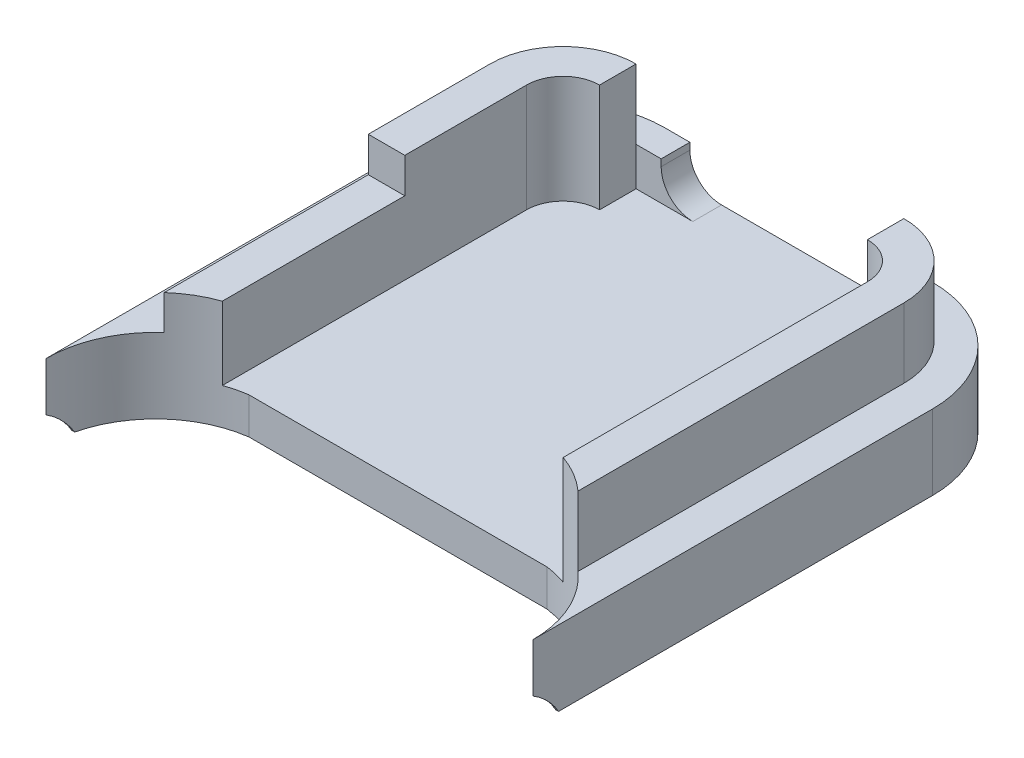
ISO-10303-21;
HEADER;
FILE_DESCRIPTION(('STEP AP214'),'2;1');
FILE_NAME('part.step','',(''),(''),'','','');
FILE_SCHEMA(('AUTOMOTIVE_DESIGN { 1 0 10303 214 1 1 1 1 }'));
ENDSEC;
DATA;
#1=APPLICATION_CONTEXT('core data for automotive mechanical design processes');
#2=APPLICATION_PROTOCOL_DEFINITION('international standard','automotive_design',2000,#1);
#3=PRODUCT_CONTEXT('',#1,'mechanical');
#4=PRODUCT('Part','Part','',(#3));
#5=PRODUCT_RELATED_PRODUCT_CATEGORY('part','',(#4));
#6=PRODUCT_DEFINITION_FORMATION('','',#4);
#7=PRODUCT_DEFINITION_CONTEXT('part definition',#1,'design');
#8=PRODUCT_DEFINITION('design','',#6,#7);
#9=PRODUCT_DEFINITION_SHAPE('','',#8);
#10=(LENGTH_UNIT() NAMED_UNIT(*) SI_UNIT(.MILLI.,.METRE.));
#11=(NAMED_UNIT(*) PLANE_ANGLE_UNIT() SI_UNIT($,.RADIAN.));
#12=(NAMED_UNIT(*) SI_UNIT($,.STERADIAN.) SOLID_ANGLE_UNIT());
#13=UNCERTAINTY_MEASURE_WITH_UNIT(LENGTH_MEASURE(1.E-05),#10,'distance_accuracy_value','');
#14=(GEOMETRIC_REPRESENTATION_CONTEXT(3) GLOBAL_UNCERTAINTY_ASSIGNED_CONTEXT((#13)) GLOBAL_UNIT_ASSIGNED_CONTEXT((#10,
#11,#12)) REPRESENTATION_CONTEXT('',''));
#15=CARTESIAN_POINT('',(0.,0.,0.));
#16=DIRECTION('',(0.,0.,1.));
#17=DIRECTION('',(1.,0.,0.));
#18=AXIS2_PLACEMENT_3D('',#15,#16,#17);
#19=CARTESIAN_POINT('',(18.5,0.73,-3.));
#20=DIRECTION('',(1.,0.,0.));
#21=DIRECTION('',(0.,0.,-1.));
#22=AXIS2_PLACEMENT_3D('',#19,#20,#21);
#23=PLANE('',#22);
#24=CARTESIAN_POINT('',(18.5,-1.35,-2.72000000000003));
#25=DIRECTION('',(1.,0.,0.));
#26=DIRECTION('',(0.,0.,1.));
#27=AXIS2_PLACEMENT_3D('',#24,#25,#26);
#28=CIRCLE('',#27,3.);
#29=CARTESIAN_POINT('',(18.5,0.15,-5.31807621135335));
#30=VERTEX_POINT('',#29);
#31=CARTESIAN_POINT('',(18.5,1.22276967158298,-4.26300233861874));
#32=VERTEX_POINT('',#31);
#33=EDGE_CURVE('E188',#30,#32,#28,.T.);
#34=ORIENTED_EDGE('',*,*,#33,.F.);
#35=DIRECTION('',(0.,0.,-1.));
#36=VECTOR('',#35,1.);
#37=CARTESIAN_POINT('',(18.5,0.15,-1.64440913302023));
#38=LINE('',#37,#36);
#39=CARTESIAN_POINT('',(18.5,0.15,-20.68));
#40=VERTEX_POINT('',#39);
#41=EDGE_CURVE('E385',#30,#40,#38,.T.);
#42=ORIENTED_EDGE('',*,*,#41,.T.);
#43=DIRECTION('',(0.,1.,0.));
#44=VECTOR('',#43,1.);
#45=CARTESIAN_POINT('',(18.5,0.73,-20.68));
#46=LINE('',#45,#44);
#47=CARTESIAN_POINT('',(18.5,3.23,-20.68));
#48=VERTEX_POINT('',#47);
#49=EDGE_CURVE('E482',#40,#48,#46,.T.);
#50=ORIENTED_EDGE('',*,*,#49,.T.);
#51=DIRECTION('',(0.,0.,-1.));
#52=VECTOR('',#51,1.);
#53=CARTESIAN_POINT('',(18.5,3.23,-3.));
#54=LINE('',#53,#52);
#55=CARTESIAN_POINT('',(18.5,3.23,-4.26300233861874));
#56=VERTEX_POINT('',#55);
#57=EDGE_CURVE('E462',#56,#48,#54,.T.);
#58=ORIENTED_EDGE('',*,*,#57,.F.);
#59=DIRECTION('',(0.,-1.,0.));
#60=VECTOR('',#59,1.);
#61=CARTESIAN_POINT('',(18.5,6.09,-4.26300233861874));
#62=LINE('',#61,#60);
#63=EDGE_CURVE('E380',#56,#32,#62,.T.);
#64=ORIENTED_EDGE('',*,*,#63,.T.);
#65=EDGE_LOOP('',(#34,#42,#50,#58,#64));
#66=FACE_BOUND('',#65,.T.);
#67=ADVANCED_FACE('F167',(#66),#23,.T.);
#68=CARTESIAN_POINT('',(11.67,1.65,-23.68));
#69=DIRECTION('',(0.,-1.,0.));
#70=DIRECTION('',(1.,0.,0.));
#71=AXIS2_PLACEMENT_3D('',#68,#69,#70);
#72=PLANE('',#71);
#73=DIRECTION('',(1.,0.,0.));
#74=VECTOR('',#73,1.);
#75=CARTESIAN_POINT('',(11.67,1.65,-8.72000000000004));
#76=LINE('',#75,#74);
#77=CARTESIAN_POINT('',(2.3793778553406,1.65,-8.72000000000004));
#78=VERTEX_POINT('',#77);
#79=CARTESIAN_POINT('',(14.6206221446594,1.65,-8.72000000000004));
#80=VERTEX_POINT('',#79);
#81=EDGE_CURVE('E561',#78,#80,#76,.T.);
#82=ORIENTED_EDGE('',*,*,#81,.T.);
#83=CARTESIAN_POINT('',(14.,1.65,-4.26300233861874));
#84=DIRECTION('',(0.,-1.,0.));
#85=DIRECTION('',(1.,0.,0.));
#86=AXIS2_PLACEMENT_3D('',#83,#84,#85);
#87=CIRCLE('',#86,4.5);
#88=CARTESIAN_POINT('',(15.5,1.65,-8.50564302573803));
#89=VERTEX_POINT('',#88);
#90=EDGE_CURVE('E511',#80,#89,#87,.T.);
#91=ORIENTED_EDGE('',*,*,#90,.T.);
#92=DIRECTION('',(0.,0.,1.));
#93=VECTOR('',#92,1.);
#94=CARTESIAN_POINT('',(15.5,1.65,-7.00000000000002));
#95=LINE('',#94,#93);
#96=CARTESIAN_POINT('',(15.5,1.65,-21.));
#97=VERTEX_POINT('',#96);
#98=EDGE_CURVE('E591',#97,#89,#95,.T.);
#99=ORIENTED_EDGE('',*,*,#98,.F.);
#100=CARTESIAN_POINT('',(14.,1.65,-21.));
#101=DIRECTION('',(0.,-1.,0.));
#102=DIRECTION('',(-1.,0.,0.));
#103=AXIS2_PLACEMENT_3D('',#100,#101,#102);
#104=CIRCLE('',#103,1.5);
#105=CARTESIAN_POINT('',(14.,1.65,-22.5));
#106=VERTEX_POINT('',#105);
#107=EDGE_CURVE('E595',#106,#97,#104,.T.);
#108=ORIENTED_EDGE('',*,*,#107,.F.);
#109=DIRECTION('',(0.,0.,1.));
#110=VECTOR('',#109,1.);
#111=CARTESIAN_POINT('',(14.,1.65,-24.));
#112=LINE('',#111,#110);
#113=CARTESIAN_POINT('',(14.,1.65,-24.));
#114=VERTEX_POINT('',#113);
#115=EDGE_CURVE('E599',#114,#106,#112,.T.);
#116=ORIENTED_EDGE('',*,*,#115,.F.);
#117=DIRECTION('',(1.,0.,0.));
#118=VECTOR('',#117,1.);
#119=CARTESIAN_POINT('',(3.,1.65,-24.));
#120=LINE('',#119,#118);
#121=CARTESIAN_POINT('',(11.67,1.65,-24.));
#122=VERTEX_POINT('',#121);
#123=EDGE_CURVE('E403',#122,#114,#120,.T.);
#124=ORIENTED_EDGE('',*,*,#123,.F.);
#125=DIRECTION('',(0.,0.,-1.));
#126=VECTOR('',#125,1.);
#127=CARTESIAN_POINT('',(11.67,1.65,-23.68));
#128=LINE('',#127,#126);
#129=CARTESIAN_POINT('',(11.67,1.65,-25.18));
#130=VERTEX_POINT('',#129);
#131=EDGE_CURVE('E419',#122,#130,#128,.T.);
#132=ORIENTED_EDGE('',*,*,#131,.T.);
#133=DIRECTION('',(1.,0.,0.));
#134=VECTOR('',#133,1.);
#135=CARTESIAN_POINT('',(11.67,1.65,-25.18));
#136=LINE('',#135,#134);
#137=CARTESIAN_POINT('',(5.33000000000001,1.65,-25.18));
#138=VERTEX_POINT('',#137);
#139=EDGE_CURVE('E717',#130,#138,#136,.F.);
#140=ORIENTED_EDGE('',*,*,#139,.T.);
#141=DIRECTION('',(0.,0.,-1.));
#142=VECTOR('',#141,1.);
#143=CARTESIAN_POINT('',(5.33000000000001,1.65,-23.68));
#144=LINE('',#143,#142);
#145=CARTESIAN_POINT('',(5.33000000000001,1.65,-24.));
#146=VERTEX_POINT('',#145);
#147=EDGE_CURVE('E423',#146,#138,#144,.T.);
#148=ORIENTED_EDGE('',*,*,#147,.F.);
#149=CARTESIAN_POINT('',(3.00000000000003,1.65,-24.));
#150=VERTEX_POINT('',#149);
#151=EDGE_CURVE('E415',#150,#146,#120,.T.);
#152=ORIENTED_EDGE('',*,*,#151,.F.);
#153=DIRECTION('',(0.,0.,-1.));
#154=VECTOR('',#153,1.);
#155=CARTESIAN_POINT('',(3.00000000000003,1.65,-24.));
#156=LINE('',#155,#154);
#157=CARTESIAN_POINT('',(3.00000000000002,1.65,-22.5));
#158=VERTEX_POINT('',#157);
#159=EDGE_CURVE('E623',#158,#150,#156,.T.);
#160=ORIENTED_EDGE('',*,*,#159,.F.);
#161=CARTESIAN_POINT('',(3.00000000000001,1.65,-21.));
#162=DIRECTION('',(0.,-1.,0.));
#163=DIRECTION('',(-1.,0.,0.));
#164=AXIS2_PLACEMENT_3D('',#161,#162,#163);
#165=CIRCLE('',#164,1.5);
#166=CARTESIAN_POINT('',(1.50000000000001,1.65,-21.));
#167=VERTEX_POINT('',#166);
#168=EDGE_CURVE('E641',#167,#158,#165,.T.);
#169=ORIENTED_EDGE('',*,*,#168,.F.);
#170=DIRECTION('',(0.,0.,-1.));
#171=VECTOR('',#170,1.);
#172=CARTESIAN_POINT('',(1.50000000000001,1.65,-21.));
#173=LINE('',#172,#171);
#174=CARTESIAN_POINT('',(1.50000000000001,1.65,-8.50564302573803));
#175=VERTEX_POINT('',#174);
#176=EDGE_CURVE('E602',#175,#167,#173,.T.);
#177=ORIENTED_EDGE('',*,*,#176,.F.);
#178=CARTESIAN_POINT('',(2.99999999999999,1.65,-4.26300233861874));
#179=DIRECTION('',(0.,-1.,0.));
#180=DIRECTION('',(1.,0.,0.));
#181=AXIS2_PLACEMENT_3D('',#178,#179,#180);
#182=CIRCLE('',#181,4.5);
#183=EDGE_CURVE('E540',#175,#78,#182,.T.);
#184=ORIENTED_EDGE('',*,*,#183,.T.);
#185=EDGE_LOOP('',(#82,#91,#99,#108,#116,#124,#132,#140,#148,#152,#160,#169,#177,#184));
#186=FACE_BOUND('',#185,.T.);
#187=ADVANCED_FACE('F741',(#186),#72,.F.);
#188=CARTESIAN_POINT('',(1.50000000000001,6.09,-16.));
#189=DIRECTION('',(0.,0.,-1.));
#190=DIRECTION('',(-1.,0.,0.));
#191=AXIS2_PLACEMENT_3D('',#188,#189,#190);
#192=PLANE('',#191);
#193=DIRECTION('',(-1.,0.,0.));
#194=VECTOR('',#193,1.);
#195=CARTESIAN_POINT('',(0.,4.65,-16.));
#196=LINE('',#195,#194);
#197=CARTESIAN_POINT('',(1.50000000000001,4.65,-16.));
#198=VERTEX_POINT('',#197);
#199=CARTESIAN_POINT('',(0.,4.65,-16.));
#200=VERTEX_POINT('',#199);
#201=EDGE_CURVE('E564',#198,#200,#196,.T.);
#202=ORIENTED_EDGE('',*,*,#201,.F.);
#203=DIRECTION('',(0.,-1.,0.));
#204=VECTOR('',#203,1.);
#205=CARTESIAN_POINT('',(1.50000000000001,6.09,-16.));
#206=LINE('',#205,#204);
#207=CARTESIAN_POINT('',(1.50000000000001,6.09,-16.));
#208=VERTEX_POINT('',#207);
#209=EDGE_CURVE('E659',#208,#198,#206,.T.);
#210=ORIENTED_EDGE('',*,*,#209,.F.);
#211=DIRECTION('',(1.,0.,0.));
#212=VECTOR('',#211,1.);
#213=CARTESIAN_POINT('',(1.50000000000001,6.09,-16.));
#214=LINE('',#213,#212);
#215=CARTESIAN_POINT('',(0.,6.09,-16.));
#216=VERTEX_POINT('',#215);
#217=EDGE_CURVE('E626',#216,#208,#214,.T.);
#218=ORIENTED_EDGE('',*,*,#217,.F.);
#219=DIRECTION('',(0.,-1.,0.));
#220=VECTOR('',#219,1.);
#221=CARTESIAN_POINT('',(0.,6.09,-16.));
#222=LINE('',#221,#220);
#223=EDGE_CURVE('E663',#216,#200,#222,.T.);
#224=ORIENTED_EDGE('',*,*,#223,.T.);
#225=EDGE_LOOP('',(#202,#210,#218,#224));
#226=FACE_BOUND('',#225,.T.);
#227=ADVANCED_FACE('F801',(#226),#192,.F.);
#228=CARTESIAN_POINT('',(2.99999999999998,0.73,-25.18));
#229=DIRECTION('',(0.,0.,-1.));
#230=DIRECTION('',(-1.,0.,0.));
#231=AXIS2_PLACEMENT_3D('',#228,#229,#230);
#232=PLANE('',#231);
#233=DIRECTION('',(-1.,0.,0.));
#234=VECTOR('',#233,1.);
#235=CARTESIAN_POINT('',(18.5,0.15,-25.18));
#236=LINE('',#235,#234);
#237=CARTESIAN_POINT('',(14.,0.149999999999998,-25.18));
#238=VERTEX_POINT('',#237);
#239=CARTESIAN_POINT('',(3.00000000000003,0.149999999999999,-25.18));
#240=VERTEX_POINT('',#239);
#241=EDGE_CURVE('E397',#238,#240,#236,.T.);
#242=ORIENTED_EDGE('',*,*,#241,.T.);
#243=DIRECTION('',(0.,1.,0.));
#244=VECTOR('',#243,1.);
#245=CARTESIAN_POINT('',(2.99999999999998,0.73,-25.18));
#246=LINE('',#245,#244);
#247=CARTESIAN_POINT('',(2.99999999999999,3.2300025,-25.18));
#248=VERTEX_POINT('',#247);
#249=EDGE_CURVE('E481',#240,#248,#246,.T.);
#250=ORIENTED_EDGE('',*,*,#249,.T.);
#251=DIRECTION('',(-1.,0.,0.));
#252=VECTOR('',#251,1.);
#253=CARTESIAN_POINT('',(2.99999999999998,3.23,-25.18));
#254=LINE('',#253,#252);
#255=CARTESIAN_POINT('',(4.03000000000001,3.23,-25.18));
#256=VERTEX_POINT('',#255);
#257=EDGE_CURVE('E469',#256,#248,#254,.T.);
#258=ORIENTED_EDGE('',*,*,#257,.F.);
#259=DIRECTION('',(0.,1.,0.));
#260=VECTOR('',#259,1.);
#261=CARTESIAN_POINT('',(4.03000000000001,3.23,-25.18));
#262=LINE('',#261,#260);
#263=CARTESIAN_POINT('',(4.03000000000001,2.95,-25.18));
#264=VERTEX_POINT('',#263);
#265=EDGE_CURVE('E434',#264,#256,#262,.T.);
#266=ORIENTED_EDGE('',*,*,#265,.F.);
#267=CARTESIAN_POINT('',(5.33000000000001,2.95,-25.18));
#268=DIRECTION('',(0.,0.,-1.));
#269=DIRECTION('',(-1.,0.,0.));
#270=AXIS2_PLACEMENT_3D('',#267,#268,#269);
#271=CIRCLE('',#270,1.3);
#272=EDGE_CURVE('E491',#138,#264,#271,.T.);
#273=ORIENTED_EDGE('',*,*,#272,.F.);
#274=ORIENTED_EDGE('',*,*,#139,.F.);
#275=CARTESIAN_POINT('',(11.67,2.95,-25.18));
#276=DIRECTION('',(0.,0.,-1.));
#277=DIRECTION('',(-1.,0.,0.));
#278=AXIS2_PLACEMENT_3D('',#275,#276,#277);
#279=CIRCLE('',#278,1.3);
#280=CARTESIAN_POINT('',(12.97,2.94999999999999,-25.18));
#281=VERTEX_POINT('',#280);
#282=EDGE_CURVE('E709',#281,#130,#279,.T.);
#283=ORIENTED_EDGE('',*,*,#282,.F.);
#284=DIRECTION('',(0.,-1.,0.));
#285=VECTOR('',#284,1.);
#286=CARTESIAN_POINT('',(12.97,3.23,-25.18));
#287=LINE('',#286,#285);
#288=CARTESIAN_POINT('',(12.97,3.23,-25.18));
#289=VERTEX_POINT('',#288);
#290=EDGE_CURVE('E439',#289,#281,#287,.T.);
#291=ORIENTED_EDGE('',*,*,#290,.F.);
#292=CARTESIAN_POINT('',(14.,3.23,-25.18));
#293=VERTEX_POINT('',#292);
#294=EDGE_CURVE('E463',#293,#289,#254,.T.);
#295=ORIENTED_EDGE('',*,*,#294,.F.);
#296=DIRECTION('',(0.,1.,0.));
#297=VECTOR('',#296,1.);
#298=CARTESIAN_POINT('',(13.9999999999999,0.73,-25.18));
#299=LINE('',#298,#297);
#300=EDGE_CURVE('E478',#238,#293,#299,.T.);
#301=ORIENTED_EDGE('',*,*,#300,.F.);
#302=EDGE_LOOP('',(#242,#250,#258,#266,#273,#274,#283,#291,#295,#301));
#303=FACE_BOUND('',#302,.T.);
#304=ADVANCED_FACE('F734',(#303),#232,.T.);
#305=CARTESIAN_POINT('',(14.,3.23,-21.));
#306=DIRECTION('',(0.,1.,0.));
#307=DIRECTION('',(0.,0.,1.));
#308=AXIS2_PLACEMENT_3D('',#305,#306,#307);
#309=PLANE('',#308);
#310=CARTESIAN_POINT('',(2.99999999999999,3.23,-4.26300233861874));
#311=DIRECTION('',(0.,1.,0.));
#312=DIRECTION('',(0.,0.,1.));
#313=AXIS2_PLACEMENT_3D('',#310,#311,#312);
#314=CIRCLE('',#313,4.5);
#315=CARTESIAN_POINT('',(0.,3.23,-7.61710430486844));
#316=VERTEX_POINT('',#315);
#317=CARTESIAN_POINT('',(-1.50000000000001,3.23,-4.26300233861874));
#318=VERTEX_POINT('',#317);
#319=EDGE_CURVE('E537',#316,#318,#314,.T.);
#320=ORIENTED_EDGE('',*,*,#319,.F.);
#321=DIRECTION('',(0.,0.,-1.));
#322=VECTOR('',#321,1.);
#323=CARTESIAN_POINT('',(0.,3.23,-3.));
#324=LINE('',#323,#322);
#325=CARTESIAN_POINT('',(0.,3.23,-21.));
#326=VERTEX_POINT('',#325);
#327=EDGE_CURVE('E468',#316,#326,#324,.T.);
#328=ORIENTED_EDGE('',*,*,#327,.T.);
#329=CARTESIAN_POINT('',(3.,3.23,-21.));
#330=DIRECTION('',(0.,-1.,0.));
#331=DIRECTION('',(0.,0.,-1.));
#332=AXIS2_PLACEMENT_3D('',#329,#330,#331);
#333=CIRCLE('',#332,3.);
#334=CARTESIAN_POINT('',(3.,3.23,-24.));
#335=VERTEX_POINT('',#334);
#336=EDGE_CURVE('E703',#326,#335,#333,.T.);
#337=ORIENTED_EDGE('',*,*,#336,.T.);
#338=DIRECTION('',(1.,0.,0.));
#339=VECTOR('',#338,1.);
#340=CARTESIAN_POINT('',(3.,3.23,-24.));
#341=LINE('',#340,#339);
#342=CARTESIAN_POINT('',(4.03000000000001,3.23,-24.));
#343=VERTEX_POINT('',#342);
#344=EDGE_CURVE('E692',#335,#343,#341,.T.);
#345=ORIENTED_EDGE('',*,*,#344,.T.);
#346=DIRECTION('',(0.,0.,1.));
#347=VECTOR('',#346,1.);
#348=CARTESIAN_POINT('',(4.03000000000001,3.23,-25.1800144176629));
#349=LINE('',#348,#347);
#350=EDGE_CURVE('E431',#256,#343,#349,.T.);
#351=ORIENTED_EDGE('',*,*,#350,.F.);
#352=ORIENTED_EDGE('',*,*,#257,.T.);
#353=CARTESIAN_POINT('',(3.,3.23,-20.6800144176629));
#354=DIRECTION('',(0.,1.,0.));
#355=DIRECTION('',(0.,0.,1.));
#356=AXIS2_PLACEMENT_3D('',#353,#354,#355);
#357=CIRCLE('',#356,4.49998558233711);
#358=CARTESIAN_POINT('',(-1.49997116472041,3.2300025,-20.6914055513507));
#359=VERTEX_POINT('',#358);
#360=EDGE_CURVE('E398',#248,#359,#357,.T.);
#361=ORIENTED_EDGE('',*,*,#360,.T.);
#362=DIRECTION('',(-1.62990326197918E-06,0.,0.999999999998672));
#363=VECTOR('',#362,1.);
#364=CARTESIAN_POINT('',(-1.49997066170013,3.23,-21.0000252634528));
#365=LINE('',#364,#363);
#366=EDGE_CURVE('E406',#359,#318,#365,.T.);
#367=ORIENTED_EDGE('',*,*,#366,.T.);
#368=EDGE_LOOP('',(#320,#328,#337,#345,#351,#352,#361,#367));
#369=FACE_BOUND('',#368,.T.);
#370=ADVANCED_FACE('F763',(#369),#309,.T.);
#371=CARTESIAN_POINT('',(18.5,0.15,-25.18));
#372=DIRECTION('',(0.,1.,0.));
#373=DIRECTION('',(0.,0.,1.));
#374=AXIS2_PLACEMENT_3D('',#371,#372,#373);
#375=PLANE('',#374);
#376=ORIENTED_EDGE('',*,*,#41,.F.);
#377=DIRECTION('',(1.,0.,0.));
#378=VECTOR('',#377,1.);
#379=CARTESIAN_POINT('',(-1.50010866472042,0.15,-5.31807621135335));
#380=LINE('',#379,#378);
#381=CARTESIAN_POINT('',(18.3745650210133,0.15,-5.31807621135335));
#382=VERTEX_POINT('',#381);
#383=EDGE_CURVE('E373',#30,#382,#380,.F.);
#384=ORIENTED_EDGE('',*,*,#383,.T.);
#385=CARTESIAN_POINT('',(14.,0.15,-4.26300233861874));
#386=DIRECTION('',(0.,1.,0.));
#387=DIRECTION('',(0.,0.,1.));
#388=AXIS2_PLACEMENT_3D('',#385,#386,#387);
#389=CIRCLE('',#388,4.5);
#390=CARTESIAN_POINT('',(14.6206221446594,0.15,-8.72000000000004));
#391=VERTEX_POINT('',#390);
#392=EDGE_CURVE('E498',#382,#391,#389,.T.);
#393=ORIENTED_EDGE('',*,*,#392,.T.);
#394=DIRECTION('',(-1.,0.,0.));
#395=VECTOR('',#394,1.);
#396=CARTESIAN_POINT('',(18.5,0.15,-8.72000000000004));
#397=LINE('',#396,#395);
#398=CARTESIAN_POINT('',(2.3793778553406,0.15,-8.72000000000004));
#399=VERTEX_POINT('',#398);
#400=EDGE_CURVE('E181',#391,#399,#397,.T.);
#401=ORIENTED_EDGE('',*,*,#400,.T.);
#402=CARTESIAN_POINT('',(2.99999999999999,0.15,-4.26300233861874));
#403=DIRECTION('',(0.,1.,0.));
#404=DIRECTION('',(0.,0.,1.));
#405=AXIS2_PLACEMENT_3D('',#402,#403,#404);
#406=CIRCLE('',#405,4.5);
#407=CARTESIAN_POINT('',(-1.37456502101327,0.15,-5.31807621135335));
#408=VERTEX_POINT('',#407);
#409=EDGE_CURVE('E497',#399,#408,#406,.T.);
#410=ORIENTED_EDGE('',*,*,#409,.T.);
#411=CARTESIAN_POINT('',(-1.49999622176005,0.149999999999999,-5.3180762113499));
#412=VERTEX_POINT('',#411);
#413=EDGE_CURVE('E196',#408,#412,#380,.F.);
#414=ORIENTED_EDGE('',*,*,#413,.T.);
#415=DIRECTION('',(-1.62990326197918E-06,0.,0.999999999998672));
#416=VECTOR('',#415,1.);
#417=CARTESIAN_POINT('',(-1.50000488970583,0.15,-2.4448628627195E-06));
#418=LINE('',#417,#416);
#419=CARTESIAN_POINT('',(-1.49997116472041,0.15,-20.6914055513507));
#420=VERTEX_POINT('',#419);
#421=EDGE_CURVE('E677',#420,#412,#418,.T.);
#422=ORIENTED_EDGE('',*,*,#421,.F.);
#423=CARTESIAN_POINT('',(3.,0.149999999999999,-20.6800144176629));
#424=DIRECTION('',(0.,1.,0.));
#425=DIRECTION('',(-1.,0.,0.));
#426=AXIS2_PLACEMENT_3D('',#423,#424,#425);
#427=CIRCLE('',#426,4.49998558233711);
#428=EDGE_CURVE('E671',#240,#420,#427,.T.);
#429=ORIENTED_EDGE('',*,*,#428,.F.);
#430=ORIENTED_EDGE('',*,*,#241,.F.);
#431=CARTESIAN_POINT('',(14.,0.149999999999998,-20.68));
#432=DIRECTION('',(0.,1.,0.));
#433=DIRECTION('',(-1.,0.,0.));
#434=AXIS2_PLACEMENT_3D('',#431,#432,#433);
#435=CIRCLE('',#434,4.49999999999999);
#436=EDGE_CURVE('E395',#40,#238,#435,.T.);
#437=ORIENTED_EDGE('',*,*,#436,.F.);
#438=EDGE_LOOP('',(#376,#384,#393,#401,#410,#414,#422,#429,#430,#437));
#439=FACE_BOUND('',#438,.T.);
#440=ADVANCED_FACE('F392',(#439),#375,.F.);
#441=CARTESIAN_POINT('',(3.,0.73,-24.));
#442=DIRECTION('',(0.,0.,1.));
#443=DIRECTION('',(1.,0.,0.));
#444=AXIS2_PLACEMENT_3D('',#441,#442,#443);
#445=PLANE('',#444);
#446=DIRECTION('',(0.,1.,0.));
#447=VECTOR('',#446,1.);
#448=CARTESIAN_POINT('',(3.,0.73,-24.));
#449=LINE('',#448,#447);
#450=EDGE_CURVE('E710',#150,#335,#449,.T.);
#451=ORIENTED_EDGE('',*,*,#450,.F.);
#452=ORIENTED_EDGE('',*,*,#151,.T.);
#453=CARTESIAN_POINT('',(5.33000000000001,2.95,-24.));
#454=DIRECTION('',(0.,0.,1.));
#455=DIRECTION('',(1.,0.,0.));
#456=AXIS2_PLACEMENT_3D('',#453,#454,#455);
#457=CIRCLE('',#456,1.3);
#458=CARTESIAN_POINT('',(4.03000000000001,2.95,-24.));
#459=VERTEX_POINT('',#458);
#460=EDGE_CURVE('E450',#459,#146,#457,.T.);
#461=ORIENTED_EDGE('',*,*,#460,.F.);
#462=DIRECTION('',(0.,1.,0.));
#463=VECTOR('',#462,1.);
#464=CARTESIAN_POINT('',(4.03000000000001,0.73,-24.));
#465=LINE('',#464,#463);
#466=EDGE_CURVE('E435',#459,#343,#465,.T.);
#467=ORIENTED_EDGE('',*,*,#466,.T.);
#468=ORIENTED_EDGE('',*,*,#344,.F.);
#469=EDGE_LOOP('',(#451,#452,#461,#467,#468));
#470=FACE_BOUND('',#469,.T.);
#471=ADVANCED_FACE('F769',(#470),#445,.T.);
#472=CARTESIAN_POINT('',(11.67,2.95,-24.));
#473=DIRECTION('',(0.,0.,1.));
#474=DIRECTION('',(1.,0.,0.));
#475=AXIS2_PLACEMENT_3D('',#472,#473,#474);
#476=CIRCLE('',#475,1.3);
#477=CARTESIAN_POINT('',(12.97,2.95,-24.));
#478=VERTEX_POINT('',#477);
#479=EDGE_CURVE('E447',#122,#478,#476,.T.);
#480=ORIENTED_EDGE('',*,*,#479,.F.);
#481=ORIENTED_EDGE('',*,*,#123,.T.);
#482=DIRECTION('',(0.,1.,0.));
#483=VECTOR('',#482,1.);
#484=CARTESIAN_POINT('',(14.,0.73,-24.));
#485=LINE('',#484,#483);
#486=CARTESIAN_POINT('',(14.,3.23,-24.));
#487=VERTEX_POINT('',#486);
#488=EDGE_CURVE('E705',#114,#487,#485,.T.);
#489=ORIENTED_EDGE('',*,*,#488,.T.);
#490=CARTESIAN_POINT('',(12.97,3.23,-24.));
#491=VERTEX_POINT('',#490);
#492=EDGE_CURVE('E696',#491,#487,#341,.T.);
#493=ORIENTED_EDGE('',*,*,#492,.F.);
#494=DIRECTION('',(0.,-1.,0.));
#495=VECTOR('',#494,1.);
#496=CARTESIAN_POINT('',(12.97,0.729999999999876,-24.));
#497=LINE('',#496,#495);
#498=EDGE_CURVE('E443',#491,#478,#497,.T.);
#499=ORIENTED_EDGE('',*,*,#498,.T.);
#500=EDGE_LOOP('',(#480,#481,#489,#493,#499));
#501=FACE_BOUND('',#500,.T.);
#502=ADVANCED_FACE('F746',(#501),#445,.T.);
#503=CARTESIAN_POINT('',(14.,0.73,-20.68));
#504=DIRECTION('',(0.,1.,0.));
#505=DIRECTION('',(0.,0.,1.));
#506=AXIS2_PLACEMENT_3D('',#503,#504,#505);
#507=CYLINDRICAL_SURFACE('',#506,4.5);
#508=ORIENTED_EDGE('',*,*,#49,.F.);
#509=ORIENTED_EDGE('',*,*,#436,.T.);
#510=ORIENTED_EDGE('',*,*,#300,.T.);
#511=CARTESIAN_POINT('',(14.,3.23,-20.68));
#512=DIRECTION('',(0.,1.,0.));
#513=DIRECTION('',(0.,0.,1.));
#514=AXIS2_PLACEMENT_3D('',#511,#512,#513);
#515=CIRCLE('',#514,4.5);
#516=EDGE_CURVE('E476',#48,#293,#515,.T.);
#517=ORIENTED_EDGE('',*,*,#516,.F.);
#518=EDGE_LOOP('',(#508,#509,#510,#517));
#519=FACE_BOUND('',#518,.T.);
#520=ADVANCED_FACE('F753',(#519),#507,.T.);
#521=CARTESIAN_POINT('',(14.,3.23,-4.26300233861874));
#522=DIRECTION('',(0.,1.,0.));
#523=DIRECTION('',(0.,0.,1.));
#524=AXIS2_PLACEMENT_3D('',#521,#522,#523);
#525=CIRCLE('',#524,4.5);
#526=CARTESIAN_POINT('',(17.,3.23,-7.61710430486843));
#527=VERTEX_POINT('',#526);
#528=EDGE_CURVE('E550',#56,#527,#525,.T.);
#529=ORIENTED_EDGE('',*,*,#528,.F.);
#530=ORIENTED_EDGE('',*,*,#57,.T.);
#531=ORIENTED_EDGE('',*,*,#516,.T.);
#532=ORIENTED_EDGE('',*,*,#294,.T.);
#533=DIRECTION('',(0.,0.,1.));
#534=VECTOR('',#533,1.);
#535=CARTESIAN_POINT('',(12.97,3.23,-25.1800144176629));
#536=LINE('',#535,#534);
#537=EDGE_CURVE('E430',#289,#491,#536,.T.);
#538=ORIENTED_EDGE('',*,*,#537,.T.);
#539=ORIENTED_EDGE('',*,*,#492,.T.);
#540=CARTESIAN_POINT('',(14.,3.23,-21.));
#541=DIRECTION('',(0.,-1.,0.));
#542=DIRECTION('',(0.,0.,1.));
#543=AXIS2_PLACEMENT_3D('',#540,#541,#542);
#544=CIRCLE('',#543,3.);
#545=CARTESIAN_POINT('',(17.,3.23,-21.));
#546=VERTEX_POINT('',#545);
#547=EDGE_CURVE('E454',#487,#546,#544,.T.);
#548=ORIENTED_EDGE('',*,*,#547,.T.);
#549=DIRECTION('',(0.,0.,1.));
#550=VECTOR('',#549,1.);
#551=CARTESIAN_POINT('',(17.,3.23,-3.));
#552=LINE('',#551,#550);
#553=EDGE_CURVE('E458',#546,#527,#552,.T.);
#554=ORIENTED_EDGE('',*,*,#553,.T.);
#555=EDGE_LOOP('',(#529,#530,#531,#532,#538,#539,#548,#554));
#556=FACE_BOUND('',#555,.T.);
#557=ADVANCED_FACE('F750',(#556),#309,.T.);
#558=CARTESIAN_POINT('',(12.97,3.23,-25.1800144176629));
#559=DIRECTION('',(-1.,0.,0.));
#560=DIRECTION('',(0.,-1.,0.));
#561=AXIS2_PLACEMENT_3D('',#558,#559,#560);
#562=PLANE('',#561);
#563=ORIENTED_EDGE('',*,*,#537,.F.);
#564=ORIENTED_EDGE('',*,*,#290,.T.);
#565=DIRECTION('',(0.,0.,-1.));
#566=VECTOR('',#565,1.);
#567=CARTESIAN_POINT('',(12.97,2.95,-23.68));
#568=LINE('',#567,#566);
#569=EDGE_CURVE('E416',#478,#281,#568,.T.);
#570=ORIENTED_EDGE('',*,*,#569,.F.);
#571=ORIENTED_EDGE('',*,*,#498,.F.);
#572=EDGE_LOOP('',(#563,#564,#570,#571));
#573=FACE_BOUND('',#572,.T.);
#574=ADVANCED_FACE('F730',(#573),#562,.T.);
#575=CARTESIAN_POINT('',(4.03000000000001,3.23,-25.1800144176629));
#576=DIRECTION('',(1.,0.,0.));
#577=DIRECTION('',(0.,0.,-1.));
#578=AXIS2_PLACEMENT_3D('',#575,#576,#577);
#579=PLANE('',#578);
#580=DIRECTION('',(0.,0.,-1.));
#581=VECTOR('',#580,1.);
#582=CARTESIAN_POINT('',(4.03000000000001,2.95,-23.68));
#583=LINE('',#582,#581);
#584=EDGE_CURVE('E427',#459,#264,#583,.T.);
#585=ORIENTED_EDGE('',*,*,#584,.T.);
#586=ORIENTED_EDGE('',*,*,#265,.T.);
#587=ORIENTED_EDGE('',*,*,#350,.T.);
#588=ORIENTED_EDGE('',*,*,#466,.F.);
#589=EDGE_LOOP('',(#585,#586,#587,#588));
#590=FACE_BOUND('',#589,.T.);
#591=ADVANCED_FACE('F765',(#590),#579,.T.);
#592=CARTESIAN_POINT('',(5.33000000000001,2.95,-23.68));
#593=DIRECTION('',(0.,0.,-1.));
#594=DIRECTION('',(-1.,0.,0.));
#595=AXIS2_PLACEMENT_3D('',#592,#593,#594);
#596=CYLINDRICAL_SURFACE('',#595,1.3);
#597=ORIENTED_EDGE('',*,*,#460,.T.);
#598=ORIENTED_EDGE('',*,*,#147,.T.);
#599=ORIENTED_EDGE('',*,*,#272,.T.);
#600=ORIENTED_EDGE('',*,*,#584,.F.);
#601=EDGE_LOOP('',(#597,#598,#599,#600));
#602=FACE_BOUND('',#601,.T.);
#603=ADVANCED_FACE('F772',(#602),#596,.F.);
#604=CARTESIAN_POINT('',(11.67,2.95,-23.68));
#605=DIRECTION('',(0.,0.,-1.));
#606=DIRECTION('',(-1.,0.,0.));
#607=AXIS2_PLACEMENT_3D('',#604,#605,#606);
#608=CYLINDRICAL_SURFACE('',#607,1.3);
#609=ORIENTED_EDGE('',*,*,#479,.T.);
#610=ORIENTED_EDGE('',*,*,#569,.T.);
#611=ORIENTED_EDGE('',*,*,#282,.T.);
#612=ORIENTED_EDGE('',*,*,#131,.F.);
#613=EDGE_LOOP('',(#609,#610,#611,#612));
#614=FACE_BOUND('',#613,.T.);
#615=ADVANCED_FACE('F738',(#614),#608,.F.);
#616=CARTESIAN_POINT('',(3.,0.149999999999999,-20.6800144176629));
#617=DIRECTION('',(0.,1.,0.));
#618=DIRECTION('',(-1.,0.,0.));
#619=AXIS2_PLACEMENT_3D('',#616,#617,#618);
#620=CYLINDRICAL_SURFACE('',#619,4.49998558233711);
#621=ORIENTED_EDGE('',*,*,#249,.F.);
#622=ORIENTED_EDGE('',*,*,#428,.T.);
#623=DIRECTION('',(0.,1.,0.));
#624=VECTOR('',#623,1.);
#625=CARTESIAN_POINT('',(-1.49997116472041,0.15,-20.6914055513507));
#626=LINE('',#625,#624);
#627=EDGE_CURVE('E409',#420,#359,#626,.T.);
#628=ORIENTED_EDGE('',*,*,#627,.T.);
#629=ORIENTED_EDGE('',*,*,#360,.F.);
#630=EDGE_LOOP('',(#621,#622,#628,#629));
#631=FACE_BOUND('',#630,.T.);
#632=ADVANCED_FACE('F758',(#631),#620,.T.);
#633=CARTESIAN_POINT('',(-1.50000488970583,0.15,-2.4448628627195E-06));
#634=DIRECTION('',(-0.999999999998672,0.,-1.62990326197918E-06));
#635=DIRECTION('',(-1.62990326197918E-06,0.,0.999999999998672));
#636=AXIS2_PLACEMENT_3D('',#633,#634,#635);
#637=PLANE('',#636);
#638=CARTESIAN_POINT('',(-1.50000045637294,-1.35,-2.72000000000003));
#639=DIRECTION('',(-0.999999999998672,0.,-1.62990326197918E-06));
#640=DIRECTION('',(-1.62990326197918E-06,0.,0.999999999998672));
#641=AXIS2_PLACEMENT_3D('',#638,#639,#640);
#642=CIRCLE('',#641,3.);
#643=CARTESIAN_POINT('',(-1.50000000000001,1.22276967158298,-4.26300233861874));
#644=VERTEX_POINT('',#643);
#645=EDGE_CURVE('E389',#644,#412,#642,.T.);
#646=ORIENTED_EDGE('',*,*,#645,.F.);
#647=DIRECTION('',(0.,-1.,0.));
#648=VECTOR('',#647,1.);
#649=CARTESIAN_POINT('',(-1.50000000000001,6.09,-4.26300233861874));
#650=LINE('',#649,#648);
#651=EDGE_CURVE('E520',#318,#644,#650,.T.);
#652=ORIENTED_EDGE('',*,*,#651,.F.);
#653=ORIENTED_EDGE('',*,*,#366,.F.);
#654=ORIENTED_EDGE('',*,*,#627,.F.);
#655=ORIENTED_EDGE('',*,*,#421,.T.);
#656=EDGE_LOOP('',(#646,#652,#653,#654,#655));
#657=FACE_BOUND('',#656,.T.);
#658=ADVANCED_FACE('F815',(#657),#637,.T.);
#659=CARTESIAN_POINT('',(3.00000000000001,6.09,-21.));
#660=DIRECTION('',(0.,-1.,0.));
#661=DIRECTION('',(1.,0.,0.));
#662=AXIS2_PLACEMENT_3D('',#659,#660,#661);
#663=CYLINDRICAL_SURFACE('',#662,3.);
#664=ORIENTED_EDGE('',*,*,#336,.F.);
#665=DIRECTION('',(0.,-1.,0.));
#666=VECTOR('',#665,1.);
#667=CARTESIAN_POINT('',(0.,6.09,-21.));
#668=LINE('',#667,#666);
#669=CARTESIAN_POINT('',(0.,6.09,-21.));
#670=VERTEX_POINT('',#669);
#671=EDGE_CURVE('E667',#670,#326,#668,.T.);
#672=ORIENTED_EDGE('',*,*,#671,.F.);
#673=CARTESIAN_POINT('',(3.00000000000001,6.09,-21.));
#674=DIRECTION('',(0.,1.,0.));
#675=DIRECTION('',(-1.,0.,0.));
#676=AXIS2_PLACEMENT_3D('',#673,#674,#675);
#677=CIRCLE('',#676,3.);
#678=CARTESIAN_POINT('',(3.00000000000003,6.09,-24.));
#679=VERTEX_POINT('',#678);
#680=EDGE_CURVE('E618',#679,#670,#677,.T.);
#681=ORIENTED_EDGE('',*,*,#680,.F.);
#682=DIRECTION('',(0.,-1.,0.));
#683=VECTOR('',#682,1.);
#684=CARTESIAN_POINT('',(3.00000000000003,6.09,-24.));
#685=LINE('',#684,#683);
#686=EDGE_CURVE('E638',#679,#335,#685,.T.);
#687=ORIENTED_EDGE('',*,*,#686,.T.);
#688=EDGE_LOOP('',(#664,#672,#681,#687));
#689=FACE_BOUND('',#688,.T.);
#690=ADVANCED_FACE('F809',(#689),#663,.T.);
#691=CARTESIAN_POINT('',(0.,6.09,-21.));
#692=DIRECTION('',(1.,0.,0.));
#693=DIRECTION('',(0.,0.,-1.));
#694=AXIS2_PLACEMENT_3D('',#691,#692,#693);
#695=PLANE('',#694);
#696=ORIENTED_EDGE('',*,*,#327,.F.);
#697=DIRECTION('',(0.,-1.,0.));
#698=VECTOR('',#697,1.);
#699=CARTESIAN_POINT('',(0.,6.09,-7.61710430486844));
#700=LINE('',#699,#698);
#701=CARTESIAN_POINT('',(0.,4.65,-7.61710430486843));
#702=VERTEX_POINT('',#701);
#703=EDGE_CURVE('E518',#316,#702,#700,.F.);
#704=ORIENTED_EDGE('',*,*,#703,.T.);
#705=DIRECTION('',(0.,0.,-1.));
#706=VECTOR('',#705,1.);
#707=CARTESIAN_POINT('',(0.,4.65,-6.00000000000002));
#708=LINE('',#707,#706);
#709=EDGE_CURVE('E568',#702,#200,#708,.T.);
#710=ORIENTED_EDGE('',*,*,#709,.T.);
#711=ORIENTED_EDGE('',*,*,#223,.F.);
#712=DIRECTION('',(0.,0.,1.));
#713=VECTOR('',#712,1.);
#714=CARTESIAN_POINT('',(0.,6.09,-21.));
#715=LINE('',#714,#713);
#716=EDGE_CURVE('E622',#670,#216,#715,.T.);
#717=ORIENTED_EDGE('',*,*,#716,.F.);
#718=ORIENTED_EDGE('',*,*,#671,.T.);
#719=EDGE_LOOP('',(#696,#704,#710,#711,#717,#718));
#720=FACE_BOUND('',#719,.T.);
#721=ADVANCED_FACE('F798',(#720),#695,.F.);
#722=CARTESIAN_POINT('',(1.50000000000001,6.09,-21.));
#723=DIRECTION('',(-1.,0.,0.));
#724=DIRECTION('',(0.,-1.,0.));
#725=AXIS2_PLACEMENT_3D('',#722,#723,#724);
#726=PLANE('',#725);
#727=DIRECTION('',(0.,0.,-1.));
#728=VECTOR('',#727,1.);
#729=CARTESIAN_POINT('',(1.50000000000001,4.65,-6.00000000000002));
#730=LINE('',#729,#728);
#731=CARTESIAN_POINT('',(1.50000000000001,4.65,-8.50564302573803));
#732=VERTEX_POINT('',#731);
#733=EDGE_CURVE('E571',#732,#198,#730,.T.);
#734=ORIENTED_EDGE('',*,*,#733,.F.);
#735=DIRECTION('',(0.,-1.,0.));
#736=VECTOR('',#735,1.);
#737=CARTESIAN_POINT('',(1.50000000000001,6.09,-8.50564302573803));
#738=LINE('',#737,#736);
#739=EDGE_CURVE('E513',#732,#175,#738,.T.);
#740=ORIENTED_EDGE('',*,*,#739,.T.);
#741=ORIENTED_EDGE('',*,*,#176,.T.);
#742=DIRECTION('',(0.,-1.,0.));
#743=VECTOR('',#742,1.);
#744=CARTESIAN_POINT('',(1.50000000000001,6.09,-21.));
#745=LINE('',#744,#743);
#746=CARTESIAN_POINT('',(1.50000000000001,6.09,-21.));
#747=VERTEX_POINT('',#746);
#748=EDGE_CURVE('E655',#747,#167,#745,.T.);
#749=ORIENTED_EDGE('',*,*,#748,.F.);
#750=DIRECTION('',(0.,0.,-1.));
#751=VECTOR('',#750,1.);
#752=CARTESIAN_POINT('',(1.50000000000001,6.09,-21.));
#753=LINE('',#752,#751);
#754=EDGE_CURVE('E629',#208,#747,#753,.T.);
#755=ORIENTED_EDGE('',*,*,#754,.F.);
#756=ORIENTED_EDGE('',*,*,#209,.T.);
#757=EDGE_LOOP('',(#734,#740,#741,#749,#755,#756));
#758=FACE_BOUND('',#757,.T.);
#759=ADVANCED_FACE('F787',(#758),#726,.F.);
#760=CARTESIAN_POINT('',(3.00000000000001,6.09,-21.));
#761=DIRECTION('',(0.,-1.,0.));
#762=DIRECTION('',(1.,0.,0.));
#763=AXIS2_PLACEMENT_3D('',#760,#761,#762);
#764=CYLINDRICAL_SURFACE('',#763,1.5);
#765=ORIENTED_EDGE('',*,*,#168,.T.);
#766=DIRECTION('',(0.,-1.,0.));
#767=VECTOR('',#766,1.);
#768=CARTESIAN_POINT('',(3.00000000000002,6.09,-22.5));
#769=LINE('',#768,#767);
#770=CARTESIAN_POINT('',(3.00000000000002,6.09,-22.5));
#771=VERTEX_POINT('',#770);
#772=EDGE_CURVE('E651',#771,#158,#769,.T.);
#773=ORIENTED_EDGE('',*,*,#772,.F.);
#774=CARTESIAN_POINT('',(3.00000000000001,6.09,-21.));
#775=DIRECTION('',(0.,-1.,0.));
#776=DIRECTION('',(-1.,0.,0.));
#777=AXIS2_PLACEMENT_3D('',#774,#775,#776);
#778=CIRCLE('',#777,1.5);
#779=EDGE_CURVE('E632',#747,#771,#778,.T.);
#780=ORIENTED_EDGE('',*,*,#779,.F.);
#781=ORIENTED_EDGE('',*,*,#748,.T.);
#782=EDGE_LOOP('',(#765,#773,#780,#781));
#783=FACE_BOUND('',#782,.T.);
#784=ADVANCED_FACE('F782',(#783),#764,.F.);
#785=CARTESIAN_POINT('',(3.00000000000003,6.09,-24.));
#786=DIRECTION('',(-1.,0.,0.));
#787=DIRECTION('',(0.,0.,1.));
#788=AXIS2_PLACEMENT_3D('',#785,#786,#787);
#789=PLANE('',#788);
#790=ORIENTED_EDGE('',*,*,#159,.T.);
#791=ORIENTED_EDGE('',*,*,#450,.T.);
#792=ORIENTED_EDGE('',*,*,#686,.F.);
#793=DIRECTION('',(0.,0.,-1.));
#794=VECTOR('',#793,1.);
#795=CARTESIAN_POINT('',(3.00000000000003,6.09,-24.));
#796=LINE('',#795,#794);
#797=EDGE_CURVE('E635',#771,#679,#796,.T.);
#798=ORIENTED_EDGE('',*,*,#797,.F.);
#799=ORIENTED_EDGE('',*,*,#772,.T.);
#800=EDGE_LOOP('',(#790,#791,#792,#798,#799));
#801=FACE_BOUND('',#800,.T.);
#802=ADVANCED_FACE('F776',(#801),#789,.F.);
#803=CARTESIAN_POINT('',(3.00000000000001,6.09,-21.));
#804=DIRECTION('',(0.,1.,0.));
#805=DIRECTION('',(-1.,0.,0.));
#806=AXIS2_PLACEMENT_3D('',#803,#804,#805);
#807=PLANE('',#806);
#808=ORIENTED_EDGE('',*,*,#680,.T.);
#809=ORIENTED_EDGE('',*,*,#716,.T.);
#810=ORIENTED_EDGE('',*,*,#217,.T.);
#811=ORIENTED_EDGE('',*,*,#754,.T.);
#812=ORIENTED_EDGE('',*,*,#779,.T.);
#813=ORIENTED_EDGE('',*,*,#797,.T.);
#814=EDGE_LOOP('',(#808,#809,#810,#811,#812,#813));
#815=FACE_BOUND('',#814,.T.);
#816=ADVANCED_FACE('F804',(#815),#807,.T.);
#817=CARTESIAN_POINT('',(14.,6.09,-21.));
#818=DIRECTION('',(0.,-1.,0.));
#819=DIRECTION('',(1.,0.,0.));
#820=AXIS2_PLACEMENT_3D('',#817,#818,#819);
#821=CYLINDRICAL_SURFACE('',#820,3.);
#822=ORIENTED_EDGE('',*,*,#547,.F.);
#823=DIRECTION('',(0.,-1.,0.));
#824=VECTOR('',#823,1.);
#825=CARTESIAN_POINT('',(14.,6.09,-24.));
#826=LINE('',#825,#824);
#827=CARTESIAN_POINT('',(14.,6.09,-24.));
#828=VERTEX_POINT('',#827);
#829=EDGE_CURVE('E574',#828,#487,#826,.T.);
#830=ORIENTED_EDGE('',*,*,#829,.F.);
#831=CARTESIAN_POINT('',(14.,6.09,-21.));
#832=DIRECTION('',(0.,1.,0.));
#833=DIRECTION('',(-1.,0.,0.));
#834=AXIS2_PLACEMENT_3D('',#831,#832,#833);
#835=CIRCLE('',#834,3.);
#836=CARTESIAN_POINT('',(17.,6.09,-21.));
#837=VERTEX_POINT('',#836);
#838=EDGE_CURVE('E596',#837,#828,#835,.T.);
#839=ORIENTED_EDGE('',*,*,#838,.F.);
#840=DIRECTION('',(0.,-1.,0.));
#841=VECTOR('',#840,1.);
#842=CARTESIAN_POINT('',(17.,6.09,-21.));
#843=LINE('',#842,#841);
#844=EDGE_CURVE('E586',#837,#546,#843,.T.);
#845=ORIENTED_EDGE('',*,*,#844,.T.);
#846=EDGE_LOOP('',(#822,#830,#839,#845));
#847=FACE_BOUND('',#846,.T.);
#848=ADVANCED_FACE('F827',(#847),#821,.T.);
#849=CARTESIAN_POINT('',(14.,6.09,-24.));
#850=DIRECTION('',(1.,0.,0.));
#851=DIRECTION('',(0.,0.,-1.));
#852=AXIS2_PLACEMENT_3D('',#849,#850,#851);
#853=PLANE('',#852);
#854=ORIENTED_EDGE('',*,*,#115,.T.);
#855=DIRECTION('',(0.,-1.,0.));
#856=VECTOR('',#855,1.);
#857=CARTESIAN_POINT('',(14.,6.09,-22.5));
#858=LINE('',#857,#856);
#859=CARTESIAN_POINT('',(14.,6.09,-22.5));
#860=VERTEX_POINT('',#859);
#861=EDGE_CURVE('E578',#860,#106,#858,.T.);
#862=ORIENTED_EDGE('',*,*,#861,.F.);
#863=DIRECTION('',(0.,0.,1.));
#864=VECTOR('',#863,1.);
#865=CARTESIAN_POINT('',(14.,6.09,-24.));
#866=LINE('',#865,#864);
#867=EDGE_CURVE('E612',#828,#860,#866,.T.);
#868=ORIENTED_EDGE('',*,*,#867,.F.);
#869=ORIENTED_EDGE('',*,*,#829,.T.);
#870=ORIENTED_EDGE('',*,*,#488,.F.);
#871=EDGE_LOOP('',(#854,#862,#868,#869,#870));
#872=FACE_BOUND('',#871,.T.);
#873=ADVANCED_FACE('F920',(#872),#853,.F.);
#874=CARTESIAN_POINT('',(14.,6.09,-21.));
#875=DIRECTION('',(0.,-1.,0.));
#876=DIRECTION('',(1.,0.,0.));
#877=AXIS2_PLACEMENT_3D('',#874,#875,#876);
#878=CYLINDRICAL_SURFACE('',#877,1.5);
#879=ORIENTED_EDGE('',*,*,#107,.T.);
#880=DIRECTION('',(0.,-1.,0.));
#881=VECTOR('',#880,1.);
#882=CARTESIAN_POINT('',(15.5,6.09,-21.));
#883=LINE('',#882,#881);
#884=CARTESIAN_POINT('',(15.5,6.09,-21.));
#885=VERTEX_POINT('',#884);
#886=EDGE_CURVE('E582',#885,#97,#883,.T.);
#887=ORIENTED_EDGE('',*,*,#886,.F.);
#888=CARTESIAN_POINT('',(14.,6.09,-21.));
#889=DIRECTION('',(0.,-1.,0.));
#890=DIRECTION('',(-1.,0.,0.));
#891=AXIS2_PLACEMENT_3D('',#888,#889,#890);
#892=CIRCLE('',#891,1.5);
#893=EDGE_CURVE('E609',#860,#885,#892,.T.);
#894=ORIENTED_EDGE('',*,*,#893,.F.);
#895=ORIENTED_EDGE('',*,*,#861,.T.);
#896=EDGE_LOOP('',(#879,#887,#894,#895));
#897=FACE_BOUND('',#896,.T.);
#898=ADVANCED_FACE('F928',(#897),#878,.F.);
#899=CARTESIAN_POINT('',(15.5,6.09,-7.00000000000002));
#900=DIRECTION('',(1.,0.,0.));
#901=DIRECTION('',(0.,0.,-1.));
#902=AXIS2_PLACEMENT_3D('',#899,#900,#901);
#903=PLANE('',#902);
#904=ORIENTED_EDGE('',*,*,#98,.T.);
#905=DIRECTION('',(0.,-1.,0.));
#906=VECTOR('',#905,1.);
#907=CARTESIAN_POINT('',(15.5,6.09,-8.50564302573803));
#908=LINE('',#907,#906);
#909=CARTESIAN_POINT('',(15.5,6.09,-8.50564302573803));
#910=VERTEX_POINT('',#909);
#911=EDGE_CURVE('E553',#89,#910,#908,.F.);
#912=ORIENTED_EDGE('',*,*,#911,.T.);
#913=DIRECTION('',(0.,0.,1.));
#914=VECTOR('',#913,1.);
#915=CARTESIAN_POINT('',(15.5,6.09,-21.));
#916=LINE('',#915,#914);
#917=EDGE_CURVE('E605',#885,#910,#916,.T.);
#918=ORIENTED_EDGE('',*,*,#917,.F.);
#919=ORIENTED_EDGE('',*,*,#886,.T.);
#920=EDGE_LOOP('',(#904,#912,#918,#919));
#921=FACE_BOUND('',#920,.T.);
#922=ADVANCED_FACE('F835',(#921),#903,.F.);
#923=CARTESIAN_POINT('',(17.,6.09,-21.));
#924=DIRECTION('',(-1.,0.,0.));
#925=DIRECTION('',(0.,0.,1.));
#926=AXIS2_PLACEMENT_3D('',#923,#924,#925);
#927=PLANE('',#926);
#928=DIRECTION('',(0.,0.,-1.));
#929=VECTOR('',#928,1.);
#930=CARTESIAN_POINT('',(17.,6.09,-7.00000000000002));
#931=LINE('',#930,#929);
#932=CARTESIAN_POINT('',(17.,6.09,-7.61710430486843));
#933=VERTEX_POINT('',#932);
#934=EDGE_CURVE('E590',#933,#837,#931,.T.);
#935=ORIENTED_EDGE('',*,*,#934,.F.);
#936=DIRECTION('',(0.,-1.,0.));
#937=VECTOR('',#936,1.);
#938=CARTESIAN_POINT('',(17.,6.09,-7.61710430486843));
#939=LINE('',#938,#937);
#940=EDGE_CURVE('E546',#933,#527,#939,.T.);
#941=ORIENTED_EDGE('',*,*,#940,.T.);
#942=ORIENTED_EDGE('',*,*,#553,.F.);
#943=ORIENTED_EDGE('',*,*,#844,.F.);
#944=EDGE_LOOP('',(#935,#941,#942,#943));
#945=FACE_BOUND('',#944,.T.);
#946=ADVANCED_FACE('F824',(#945),#927,.F.);
#947=CARTESIAN_POINT('',(14.,6.09,-21.));
#948=DIRECTION('',(0.,1.,0.));
#949=DIRECTION('',(-1.,0.,0.));
#950=AXIS2_PLACEMENT_3D('',#947,#948,#949);
#951=PLANE('',#950);
#952=CARTESIAN_POINT('',(14.,6.09,-4.26300233861874));
#953=DIRECTION('',(0.,1.,0.));
#954=DIRECTION('',(-1.,0.,0.));
#955=AXIS2_PLACEMENT_3D('',#952,#953,#954);
#956=CIRCLE('',#955,4.5);
#957=EDGE_CURVE('E490',#933,#910,#956,.T.);
#958=ORIENTED_EDGE('',*,*,#957,.F.);
#959=ORIENTED_EDGE('',*,*,#934,.T.);
#960=ORIENTED_EDGE('',*,*,#838,.T.);
#961=ORIENTED_EDGE('',*,*,#867,.T.);
#962=ORIENTED_EDGE('',*,*,#893,.T.);
#963=ORIENTED_EDGE('',*,*,#917,.T.);
#964=EDGE_LOOP('',(#958,#959,#960,#961,#962,#963));
#965=FACE_BOUND('',#964,.T.);
#966=ADVANCED_FACE('F831',(#965),#951,.T.);
#967=CARTESIAN_POINT('',(0.,4.65,-6.00000000000002));
#968=DIRECTION('',(0.,-1.,0.));
#969=DIRECTION('',(0.,0.,-1.));
#970=AXIS2_PLACEMENT_3D('',#967,#968,#969);
#971=PLANE('',#970);
#972=ORIENTED_EDGE('',*,*,#709,.F.);
#973=CARTESIAN_POINT('',(2.99999999999999,4.65,-4.26300233861874));
#974=DIRECTION('',(0.,-1.,0.));
#975=DIRECTION('',(0.,0.,-1.));
#976=AXIS2_PLACEMENT_3D('',#973,#974,#975);
#977=CIRCLE('',#976,4.5);
#978=EDGE_CURVE('E486',#702,#732,#977,.T.);
#979=ORIENTED_EDGE('',*,*,#978,.T.);
#980=ORIENTED_EDGE('',*,*,#733,.T.);
#981=ORIENTED_EDGE('',*,*,#201,.T.);
#982=EDGE_LOOP('',(#972,#979,#980,#981));
#983=FACE_BOUND('',#982,.T.);
#984=ADVANCED_FACE('F793',(#983),#971,.F.);
#985=CARTESIAN_POINT('',(14.6206221446594,6.09,-8.72000000000004));
#986=DIRECTION('',(0.,0.,-1.));
#987=DIRECTION('',(-1.,0.,0.));
#988=AXIS2_PLACEMENT_3D('',#985,#986,#987);
#989=PLANE('',#988);
#990=DIRECTION('',(0.,-1.,0.));
#991=VECTOR('',#990,1.);
#992=CARTESIAN_POINT('',(2.3793778553406,6.09,-8.72000000000004));
#993=LINE('',#992,#991);
#994=EDGE_CURVE('E507',#78,#399,#993,.T.);
#995=ORIENTED_EDGE('',*,*,#994,.T.);
#996=ORIENTED_EDGE('',*,*,#400,.F.);
#997=DIRECTION('',(0.,-1.,0.));
#998=VECTOR('',#997,1.);
#999=CARTESIAN_POINT('',(14.6206221446594,6.09,-8.72000000000004));
#1000=LINE('',#999,#998);
#1001=EDGE_CURVE('E504',#80,#391,#1000,.T.);
#1002=ORIENTED_EDGE('',*,*,#1001,.F.);
#1003=ORIENTED_EDGE('',*,*,#81,.F.);
#1004=EDGE_LOOP('',(#995,#996,#1002,#1003));
#1005=FACE_BOUND('',#1004,.T.);
#1006=ADVANCED_FACE('F503',(#1005),#989,.F.);
#1007=CARTESIAN_POINT('',(14.,6.09,-4.26300233861874));
#1008=DIRECTION('',(0.,-1.,0.));
#1009=DIRECTION('',(0.,0.,-1.));
#1010=AXIS2_PLACEMENT_3D('',#1007,#1008,#1009);
#1011=CYLINDRICAL_SURFACE('',#1010,4.5);
#1012=ORIENTED_EDGE('',*,*,#392,.F.);
#1013=CARTESIAN_POINT('',(18.3745650210133,0.15,-5.31807621135335));
#1014=CARTESIAN_POINT('',(18.3845301453689,0.221591566858199,-5.27674783186056));
#1015=CARTESIAN_POINT('',(18.3945952706558,0.291462614850228,-5.232457565533));
#1016=CARTESIAN_POINT('',(18.4143341837213,0.427392296723214,-5.13820477210792));
#1017=CARTESIAN_POINT('',(18.4240077203602,0.493448495238781,-5.08823868069526));
#1018=CARTESIAN_POINT('',(18.4421587122408,0.619897154702946,-4.98408235255134));
#1019=CARTESIAN_POINT('',(18.4506575848434,0.680381476830764,-4.93000745303778));
#1020=CARTESIAN_POINT('',(18.4661249703962,0.796841182406974,-4.81705777228692));
#1021=CARTESIAN_POINT('',(18.4730942774836,0.852818896043058,-4.75818550367928));
#1022=CARTESIAN_POINT('',(18.4854987731097,0.964987520982484,-4.63016639995602));
#1023=CARTESIAN_POINT('',(18.4907260197664,1.02069602831848,-4.56057458431296));
#1024=CARTESIAN_POINT('',(18.4980014230125,1.12641346512077,-4.41574149320742));
#1025=CARTESIAN_POINT('',(18.500010419037,1.17634542635863,-4.34044213432029));
#1026=CARTESIAN_POINT('',(18.5,1.22276967158298,-4.26300233861874));
#1027=B_SPLINE_CURVE_WITH_KNOTS('',3,(#1013,#1014,#1015,#1016,#1017,#1018,#1019,#1020,#1021,
#1022,#1023,#1024,#1025,#1026),.UNSPECIFIED.,.F.,.F.,(4,2,2,2,2,2,4),(0.,0.249723802531138,
0.499605303200921,0.744058718936022,0.988384914728092,1.25586245189396,1.52657066159283),.UNSPECIFIED.);
#1028=EDGE_CURVE('E375',#382,#32,#1027,.T.);
#1029=ORIENTED_EDGE('',*,*,#1028,.T.);
#1030=ORIENTED_EDGE('',*,*,#63,.F.);
#1031=ORIENTED_EDGE('',*,*,#528,.T.);
#1032=ORIENTED_EDGE('',*,*,#940,.F.);
#1033=ORIENTED_EDGE('',*,*,#957,.T.);
#1034=ORIENTED_EDGE('',*,*,#911,.F.);
#1035=ORIENTED_EDGE('',*,*,#90,.F.);
#1036=ORIENTED_EDGE('',*,*,#1001,.T.);
#1037=EDGE_LOOP('',(#1012,#1029,#1030,#1031,#1032,#1033,#1034,#1035,#1036));
#1038=FACE_BOUND('',#1037,.T.);
#1039=ADVANCED_FACE('F509',(#1038),#1011,.F.);
#1040=CARTESIAN_POINT('',(2.99999999999999,6.09,-4.26300233861874));
#1041=DIRECTION('',(0.,-1.,0.));
#1042=DIRECTION('',(0.,0.,-1.));
#1043=AXIS2_PLACEMENT_3D('',#1040,#1041,#1042);
#1044=CYLINDRICAL_SURFACE('',#1043,4.5);
#1045=ORIENTED_EDGE('',*,*,#651,.T.);
#1046=CARTESIAN_POINT('',(-1.50000000000001,1.22276967158298,-4.26300233861874));
#1047=CARTESIAN_POINT('',(-1.50000783621492,1.17995541126069,-4.33441402142534));
#1048=CARTESIAN_POINT('',(-1.49830045731051,1.13416045969577,-4.40400928407138));
#1049=CARTESIAN_POINT('',(-1.49203099364986,1.03703306057519,-4.53905704438735));
#1050=CARTESIAN_POINT('',(-1.48746980726726,0.985702359870835,-4.60451083864699));
#1051=CARTESIAN_POINT('',(-1.47618733218092,0.879030644747042,-4.72948650983233));
#1052=CARTESIAN_POINT('',(-1.46951336592136,0.823796349556406,-4.78910402258505));
#1053=CARTESIAN_POINT('',(-1.45455113705218,0.708806428499968,-4.90355088037756));
#1054=CARTESIAN_POINT('',(-1.44626325466691,0.649051869592058,-4.95838134880455));
#1055=CARTESIAN_POINT('',(-1.42779656169881,0.519448143056742,-5.06798625506112));
#1056=CARTESIAN_POINT('',(-1.4175125704767,0.449180742380196,-5.12224883881539));
#1057=CARTESIAN_POINT('',(-1.39630513248085,0.303318698446406,-5.22491418514868));
#1058=CARTESIAN_POINT('',(-1.38537558478326,0.227671095256557,-5.27324047479079));
#1059=CARTESIAN_POINT('',(-1.37456502101327,0.15,-5.31807621135335));
#1060=B_SPLINE_CURVE_WITH_KNOTS('',3,(#1046,#1047,#1048,#1049,#1050,#1051,#1052,#1053,#1054,
#1055,#1056,#1057,#1058,#1059),.UNSPECIFIED.,.F.,.F.,(4,2,2,2,2,2,4),(0.,0.249662603209884,
0.499246652581811,0.743594869726482,0.98788559008715,1.25565492314879,1.52657536432212),.UNSPECIFIED.);
#1061=EDGE_CURVE('E12',#644,#408,#1060,.T.);
#1062=ORIENTED_EDGE('',*,*,#1061,.T.);
#1063=ORIENTED_EDGE('',*,*,#409,.F.);
#1064=ORIENTED_EDGE('',*,*,#994,.F.);
#1065=ORIENTED_EDGE('',*,*,#183,.F.);
#1066=ORIENTED_EDGE('',*,*,#739,.F.);
#1067=ORIENTED_EDGE('',*,*,#978,.F.);
#1068=ORIENTED_EDGE('',*,*,#703,.F.);
#1069=ORIENTED_EDGE('',*,*,#319,.T.);
#1070=EDGE_LOOP('',(#1045,#1062,#1063,#1064,#1065,#1066,#1067,#1068,#1069));
#1071=FACE_BOUND('',#1070,.T.);
#1072=ADVANCED_FACE('F790',(#1071),#1044,.F.);
#1073=CARTESIAN_POINT('',(-1.50010866472042,-1.35,-2.72000000000003));
#1074=DIRECTION('',(1.,0.,0.));
#1075=DIRECTION('',(0.,0.,-1.));
#1076=AXIS2_PLACEMENT_3D('',#1073,#1074,#1075);
#1077=CYLINDRICAL_SURFACE('',#1076,3.);
#1078=ORIENTED_EDGE('',*,*,#1061,.F.);
#1079=ORIENTED_EDGE('',*,*,#645,.T.);
#1080=ORIENTED_EDGE('',*,*,#413,.F.);
#1081=EDGE_LOOP('',(#1078,#1079,#1080));
#1082=FACE_BOUND('',#1081,.T.);
#1083=ADVANCED_FACE('F838',(#1082),#1077,.F.);
#1084=ORIENTED_EDGE('',*,*,#33,.T.);
#1085=ORIENTED_EDGE('',*,*,#1028,.F.);
#1086=ORIENTED_EDGE('',*,*,#383,.F.);
#1087=EDGE_LOOP('',(#1084,#1085,#1086));
#1088=FACE_BOUND('',#1087,.T.);
#1089=ADVANCED_FACE('F374',(#1088),#1077,.F.);
#1090=CLOSED_SHELL('',(#67,#187,#227,#304,#370,#440,#471,#502,#520,#557,#574,#591,#603,#615,
#632,#658,#690,#721,#759,#784,#802,#816,#848,#873,#898,#922,#946,#966,#984,#1006,#1039,#1072,
#1083,#1089));
#1091=MANIFOLD_SOLID_BREP('B2',#1090);
#1092=ADVANCED_BREP_SHAPE_REPRESENTATION('',(#18,#1091),#14);
#1093=SHAPE_DEFINITION_REPRESENTATION(#9,#1092);
ENDSEC;
END-ISO-10303-21;
